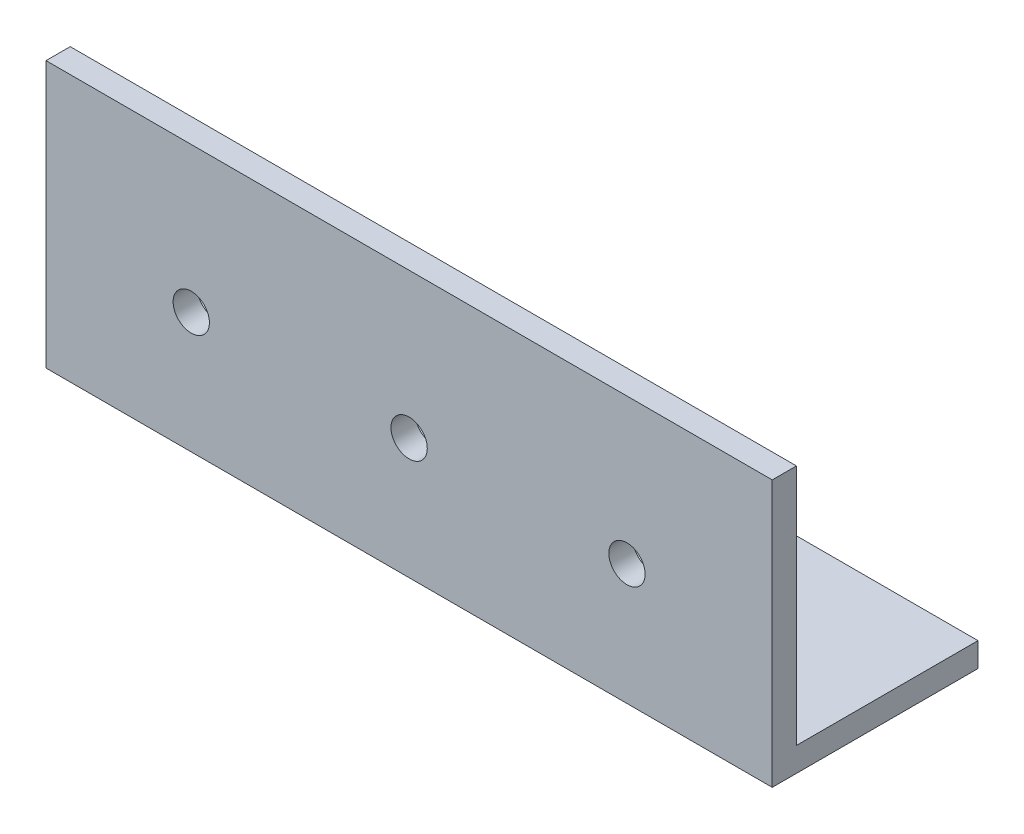
ISO-10303-21;
HEADER;
FILE_DESCRIPTION(('STEP AP214'),'2;1');
FILE_NAME('part.step','',(''),(''),'','','');
FILE_SCHEMA(('AUTOMOTIVE_DESIGN { 1 0 10303 214 1 1 1 1 }'));
ENDSEC;
DATA;
#1=APPLICATION_CONTEXT('core data for automotive mechanical design processes');
#2=APPLICATION_PROTOCOL_DEFINITION('international standard','automotive_design',2000,#1);
#3=PRODUCT_CONTEXT('',#1,'mechanical');
#4=PRODUCT('Part','Part','',(#3));
#5=PRODUCT_RELATED_PRODUCT_CATEGORY('part','',(#4));
#6=PRODUCT_DEFINITION_FORMATION('','',#4);
#7=PRODUCT_DEFINITION_CONTEXT('part definition',#1,'design');
#8=PRODUCT_DEFINITION('design','',#6,#7);
#9=PRODUCT_DEFINITION_SHAPE('','',#8);
#10=(LENGTH_UNIT() NAMED_UNIT(*) SI_UNIT(.MILLI.,.METRE.));
#11=(NAMED_UNIT(*) PLANE_ANGLE_UNIT() SI_UNIT($,.RADIAN.));
#12=(NAMED_UNIT(*) SI_UNIT($,.STERADIAN.) SOLID_ANGLE_UNIT());
#13=UNCERTAINTY_MEASURE_WITH_UNIT(LENGTH_MEASURE(1.E-05),#10,'distance_accuracy_value','');
#14=(GEOMETRIC_REPRESENTATION_CONTEXT(3) GLOBAL_UNCERTAINTY_ASSIGNED_CONTEXT((#13)) GLOBAL_UNIT_ASSIGNED_CONTEXT((#10,
#11,#12)) REPRESENTATION_CONTEXT('',''));
#15=CARTESIAN_POINT('',(0.,0.,0.));
#16=DIRECTION('',(0.,0.,1.));
#17=DIRECTION('',(1.,0.,0.));
#18=AXIS2_PLACEMENT_3D('',#15,#16,#17);
#19=CARTESIAN_POINT('',(60.,0.,-17.));
#20=DIRECTION('',(0.,1.,0.));
#21=DIRECTION('',(0.,0.,1.));
#22=AXIS2_PLACEMENT_3D('',#19,#20,#21);
#23=PLANE('',#22);
#24=CARTESIAN_POINT('',(48.,0.,-8.5));
#25=DIRECTION('',(0.,-1.,0.));
#26=DIRECTION('',(0.,0.,-1.));
#27=AXIS2_PLACEMENT_3D('',#24,#25,#26);
#28=CIRCLE('',#27,1.5);
#29=CARTESIAN_POINT('',(48.,0.,-10.));
#30=VERTEX_POINT('',#29);
#31=EDGE_CURVE('E186',#30,#30,#28,.T.);
#32=ORIENTED_EDGE('',*,*,#31,.F.);
#33=EDGE_LOOP('',(#32));
#34=FACE_BOUND('',#33,.T.);
#35=CARTESIAN_POINT('',(12.,0.,-8.5));
#36=DIRECTION('',(0.,-1.,0.));
#37=DIRECTION('',(0.,0.,-1.));
#38=AXIS2_PLACEMENT_3D('',#35,#36,#37);
#39=CIRCLE('',#38,1.5);
#40=CARTESIAN_POINT('',(12.,0.,-10.));
#41=VERTEX_POINT('',#40);
#42=EDGE_CURVE('E190',#41,#41,#39,.T.);
#43=ORIENTED_EDGE('',*,*,#42,.F.);
#44=EDGE_LOOP('',(#43));
#45=FACE_BOUND('',#44,.T.);
#46=CARTESIAN_POINT('',(30.,0.,-8.5));
#47=DIRECTION('',(0.,-1.,0.));
#48=DIRECTION('',(0.,0.,-1.));
#49=AXIS2_PLACEMENT_3D('',#46,#47,#48);
#50=CIRCLE('',#49,1.5);
#51=CARTESIAN_POINT('',(30.,0.,-10.));
#52=VERTEX_POINT('',#51);
#53=EDGE_CURVE('E148',#52,#52,#50,.T.);
#54=ORIENTED_EDGE('',*,*,#53,.F.);
#55=EDGE_LOOP('',(#54));
#56=FACE_BOUND('',#55,.T.);
#57=DIRECTION('',(0.,0.,-1.));
#58=VECTOR('',#57,1.);
#59=CARTESIAN_POINT('',(0.,0.,-17.));
#60=LINE('',#59,#58);
#61=CARTESIAN_POINT('',(0.,0.,0.));
#62=VERTEX_POINT('',#61);
#63=CARTESIAN_POINT('',(0.,0.,-17.));
#64=VERTEX_POINT('',#63);
#65=EDGE_CURVE('E129',#62,#64,#60,.T.);
#66=ORIENTED_EDGE('',*,*,#65,.T.);
#67=DIRECTION('',(-1.,0.,0.));
#68=VECTOR('',#67,1.);
#69=CARTESIAN_POINT('',(60.,0.,-17.));
#70=LINE('',#69,#68);
#71=CARTESIAN_POINT('',(60.,0.,-17.));
#72=VERTEX_POINT('',#71);
#73=EDGE_CURVE('E11',#72,#64,#70,.T.);
#74=ORIENTED_EDGE('',*,*,#73,.F.);
#75=DIRECTION('',(0.,0.,-1.));
#76=VECTOR('',#75,1.);
#77=CARTESIAN_POINT('',(60.,0.,-17.));
#78=LINE('',#77,#76);
#79=CARTESIAN_POINT('',(60.,0.,0.));
#80=VERTEX_POINT('',#79);
#81=EDGE_CURVE('E139',#80,#72,#78,.T.);
#82=ORIENTED_EDGE('',*,*,#81,.F.);
#83=DIRECTION('',(-1.,0.,0.));
#84=VECTOR('',#83,1.);
#85=CARTESIAN_POINT('',(60.,0.,0.));
#86=LINE('',#85,#84);
#87=EDGE_CURVE('E125',#80,#62,#86,.T.);
#88=ORIENTED_EDGE('',*,*,#87,.T.);
#89=EDGE_LOOP('',(#66,#74,#82,#88));
#90=FACE_BOUND('',#89,.T.);
#91=ADVANCED_FACE('F43',(#34,#45,#56,#90),#23,.F.);
#92=CARTESIAN_POINT('',(60.,2.,-17.));
#93=DIRECTION('',(0.,0.,1.));
#94=DIRECTION('',(1.,0.,0.));
#95=AXIS2_PLACEMENT_3D('',#92,#93,#94);
#96=PLANE('',#95);
#97=DIRECTION('',(0.,1.,0.));
#98=VECTOR('',#97,1.);
#99=CARTESIAN_POINT('',(0.,2.,-17.));
#100=LINE('',#99,#98);
#101=CARTESIAN_POINT('',(0.,2.,-17.));
#102=VERTEX_POINT('',#101);
#103=EDGE_CURVE('E132',#64,#102,#100,.T.);
#104=ORIENTED_EDGE('',*,*,#103,.T.);
#105=DIRECTION('',(-1.,0.,0.));
#106=VECTOR('',#105,1.);
#107=CARTESIAN_POINT('',(60.,2.,-17.));
#108=LINE('',#107,#106);
#109=CARTESIAN_POINT('',(60.,2.,-17.));
#110=VERTEX_POINT('',#109);
#111=EDGE_CURVE('E52',#110,#102,#108,.T.);
#112=ORIENTED_EDGE('',*,*,#111,.F.);
#113=DIRECTION('',(0.,1.,0.));
#114=VECTOR('',#113,1.);
#115=CARTESIAN_POINT('',(60.,2.,-17.));
#116=LINE('',#115,#114);
#117=EDGE_CURVE('E98',#72,#110,#116,.T.);
#118=ORIENTED_EDGE('',*,*,#117,.F.);
#119=ORIENTED_EDGE('',*,*,#73,.T.);
#120=EDGE_LOOP('',(#104,#112,#118,#119));
#121=FACE_BOUND('',#120,.T.);
#122=ADVANCED_FACE('F177',(#121),#96,.F.);
#123=CARTESIAN_POINT('',(60.,2.,-2.));
#124=DIRECTION('',(0.,-1.,0.));
#125=DIRECTION('',(0.,0.,-1.));
#126=AXIS2_PLACEMENT_3D('',#123,#124,#125);
#127=PLANE('',#126);
#128=CARTESIAN_POINT('',(48.,2.,-8.5));
#129=DIRECTION('',(0.,-1.,0.));
#130=DIRECTION('',(0.,0.,-1.));
#131=AXIS2_PLACEMENT_3D('',#128,#129,#130);
#132=CIRCLE('',#131,1.5);
#133=CARTESIAN_POINT('',(48.,2.,-10.));
#134=VERTEX_POINT('',#133);
#135=EDGE_CURVE('E46',#134,#134,#132,.T.);
#136=ORIENTED_EDGE('',*,*,#135,.T.);
#137=EDGE_LOOP('',(#136));
#138=FACE_BOUND('',#137,.T.);
#139=CARTESIAN_POINT('',(12.,2.,-8.5));
#140=DIRECTION('',(0.,-1.,0.));
#141=DIRECTION('',(0.,0.,-1.));
#142=AXIS2_PLACEMENT_3D('',#139,#140,#141);
#143=CIRCLE('',#142,1.5);
#144=CARTESIAN_POINT('',(12.,2.,-10.));
#145=VERTEX_POINT('',#144);
#146=EDGE_CURVE('E147',#145,#145,#143,.T.);
#147=ORIENTED_EDGE('',*,*,#146,.T.);
#148=EDGE_LOOP('',(#147));
#149=FACE_BOUND('',#148,.T.);
#150=CARTESIAN_POINT('',(30.,2.,-8.5));
#151=DIRECTION('',(0.,-1.,0.));
#152=DIRECTION('',(0.,0.,-1.));
#153=AXIS2_PLACEMENT_3D('',#150,#151,#152);
#154=CIRCLE('',#153,1.5);
#155=CARTESIAN_POINT('',(30.,2.,-10.));
#156=VERTEX_POINT('',#155);
#157=EDGE_CURVE('E145',#156,#156,#154,.T.);
#158=ORIENTED_EDGE('',*,*,#157,.T.);
#159=EDGE_LOOP('',(#158));
#160=FACE_BOUND('',#159,.T.);
#161=DIRECTION('',(0.,0.,1.));
#162=VECTOR('',#161,1.);
#163=CARTESIAN_POINT('',(0.,2.,-2.));
#164=LINE('',#163,#162);
#165=CARTESIAN_POINT('',(0.,2.,-2.));
#166=VERTEX_POINT('',#165);
#167=EDGE_CURVE('E134',#102,#166,#164,.T.);
#168=ORIENTED_EDGE('',*,*,#167,.T.);
#169=DIRECTION('',(-1.,0.,0.));
#170=VECTOR('',#169,1.);
#171=CARTESIAN_POINT('',(60.,2.,-2.));
#172=LINE('',#171,#170);
#173=CARTESIAN_POINT('',(60.,2.,-2.));
#174=VERTEX_POINT('',#173);
#175=EDGE_CURVE('E120',#174,#166,#172,.T.);
#176=ORIENTED_EDGE('',*,*,#175,.F.);
#177=DIRECTION('',(0.,0.,1.));
#178=VECTOR('',#177,1.);
#179=CARTESIAN_POINT('',(60.,2.,-2.));
#180=LINE('',#179,#178);
#181=EDGE_CURVE('E111',#110,#174,#180,.T.);
#182=ORIENTED_EDGE('',*,*,#181,.F.);
#183=ORIENTED_EDGE('',*,*,#111,.T.);
#184=EDGE_LOOP('',(#168,#176,#182,#183));
#185=FACE_BOUND('',#184,.T.);
#186=ADVANCED_FACE('F155',(#138,#149,#160,#185),#127,.F.);
#187=CARTESIAN_POINT('',(60.,22.,-2.));
#188=DIRECTION('',(0.,0.,1.));
#189=DIRECTION('',(0.,-1.,0.));
#190=AXIS2_PLACEMENT_3D('',#187,#188,#189);
#191=PLANE('',#190);
#192=CARTESIAN_POINT('',(48.,10.,-2.));
#193=DIRECTION('',(0.,0.,1.));
#194=DIRECTION('',(0.,-1.,0.));
#195=AXIS2_PLACEMENT_3D('',#192,#193,#194);
#196=CIRCLE('',#195,1.5);
#197=CARTESIAN_POINT('',(48.,8.49999999999999,-2.));
#198=VERTEX_POINT('',#197);
#199=EDGE_CURVE('E206',#198,#198,#196,.T.);
#200=ORIENTED_EDGE('',*,*,#199,.T.);
#201=EDGE_LOOP('',(#200));
#202=FACE_BOUND('',#201,.T.);
#203=CARTESIAN_POINT('',(12.,10.,-2.));
#204=DIRECTION('',(0.,0.,1.));
#205=DIRECTION('',(0.,-1.,0.));
#206=AXIS2_PLACEMENT_3D('',#203,#204,#205);
#207=CIRCLE('',#206,1.5);
#208=CARTESIAN_POINT('',(12.,8.5,-2.));
#209=VERTEX_POINT('',#208);
#210=EDGE_CURVE('E210',#209,#209,#207,.T.);
#211=ORIENTED_EDGE('',*,*,#210,.T.);
#212=EDGE_LOOP('',(#211));
#213=FACE_BOUND('',#212,.T.);
#214=CARTESIAN_POINT('',(30.,10.,-2.));
#215=DIRECTION('',(0.,0.,1.));
#216=DIRECTION('',(0.,-1.,0.));
#217=AXIS2_PLACEMENT_3D('',#214,#215,#216);
#218=CIRCLE('',#217,1.5);
#219=CARTESIAN_POINT('',(30.,8.49999999999999,-2.));
#220=VERTEX_POINT('',#219);
#221=EDGE_CURVE('E213',#220,#220,#218,.T.);
#222=ORIENTED_EDGE('',*,*,#221,.T.);
#223=EDGE_LOOP('',(#222));
#224=FACE_BOUND('',#223,.T.);
#225=DIRECTION('',(0.,1.,0.));
#226=VECTOR('',#225,1.);
#227=CARTESIAN_POINT('',(0.,22.,-2.));
#228=LINE('',#227,#226);
#229=CARTESIAN_POINT('',(0.,22.,-2.));
#230=VERTEX_POINT('',#229);
#231=EDGE_CURVE('E119',#166,#230,#228,.T.);
#232=ORIENTED_EDGE('',*,*,#231,.T.);
#233=DIRECTION('',(-1.,0.,0.));
#234=VECTOR('',#233,1.);
#235=CARTESIAN_POINT('',(60.,22.,-2.));
#236=LINE('',#235,#234);
#237=CARTESIAN_POINT('',(60.,22.,-2.));
#238=VERTEX_POINT('',#237);
#239=EDGE_CURVE('E116',#238,#230,#236,.T.);
#240=ORIENTED_EDGE('',*,*,#239,.F.);
#241=DIRECTION('',(0.,1.,0.));
#242=VECTOR('',#241,1.);
#243=CARTESIAN_POINT('',(60.,22.,-2.));
#244=LINE('',#243,#242);
#245=EDGE_CURVE('E105',#174,#238,#244,.T.);
#246=ORIENTED_EDGE('',*,*,#245,.F.);
#247=ORIENTED_EDGE('',*,*,#175,.T.);
#248=EDGE_LOOP('',(#232,#240,#246,#247));
#249=FACE_BOUND('',#248,.T.);
#250=ADVANCED_FACE('F117',(#202,#213,#224,#249),#191,.F.);
#251=CARTESIAN_POINT('',(60.,22.,0.));
#252=DIRECTION('',(0.,-1.,0.));
#253=DIRECTION('',(0.,0.,-1.));
#254=AXIS2_PLACEMENT_3D('',#251,#252,#253);
#255=PLANE('',#254);
#256=DIRECTION('',(0.,0.,1.));
#257=VECTOR('',#256,1.);
#258=CARTESIAN_POINT('',(0.,22.,0.));
#259=LINE('',#258,#257);
#260=CARTESIAN_POINT('',(0.,22.,0.));
#261=VERTEX_POINT('',#260);
#262=EDGE_CURVE('E84',#230,#261,#259,.T.);
#263=ORIENTED_EDGE('',*,*,#262,.T.);
#264=DIRECTION('',(-1.,0.,0.));
#265=VECTOR('',#264,1.);
#266=CARTESIAN_POINT('',(60.,22.,0.));
#267=LINE('',#266,#265);
#268=CARTESIAN_POINT('',(60.,22.,0.));
#269=VERTEX_POINT('',#268);
#270=EDGE_CURVE('E121',#269,#261,#267,.T.);
#271=ORIENTED_EDGE('',*,*,#270,.F.);
#272=DIRECTION('',(0.,0.,1.));
#273=VECTOR('',#272,1.);
#274=CARTESIAN_POINT('',(60.,22.,0.));
#275=LINE('',#274,#273);
#276=EDGE_CURVE('E109',#238,#269,#275,.T.);
#277=ORIENTED_EDGE('',*,*,#276,.F.);
#278=ORIENTED_EDGE('',*,*,#239,.T.);
#279=EDGE_LOOP('',(#263,#271,#277,#278));
#280=FACE_BOUND('',#279,.T.);
#281=ADVANCED_FACE('F123',(#280),#255,.F.);
#282=CARTESIAN_POINT('',(60.,0.,0.));
#283=DIRECTION('',(0.,0.,-1.));
#284=DIRECTION('',(-1.,0.,0.));
#285=AXIS2_PLACEMENT_3D('',#282,#283,#284);
#286=PLANE('',#285);
#287=CARTESIAN_POINT('',(48.,10.,0.));
#288=DIRECTION('',(0.,0.,1.));
#289=DIRECTION('',(1.,0.,0.));
#290=AXIS2_PLACEMENT_3D('',#287,#288,#289);
#291=CIRCLE('',#290,1.5);
#292=CARTESIAN_POINT('',(49.5,10.,0.));
#293=VERTEX_POINT('',#292);
#294=EDGE_CURVE('E220',#293,#293,#291,.T.);
#295=ORIENTED_EDGE('',*,*,#294,.F.);
#296=EDGE_LOOP('',(#295));
#297=FACE_BOUND('',#296,.T.);
#298=CARTESIAN_POINT('',(12.,10.,0.));
#299=DIRECTION('',(0.,0.,1.));
#300=DIRECTION('',(1.,0.,0.));
#301=AXIS2_PLACEMENT_3D('',#298,#299,#300);
#302=CIRCLE('',#301,1.5);
#303=CARTESIAN_POINT('',(13.5,10.,0.));
#304=VERTEX_POINT('',#303);
#305=EDGE_CURVE('E219',#304,#304,#302,.T.);
#306=ORIENTED_EDGE('',*,*,#305,.F.);
#307=EDGE_LOOP('',(#306));
#308=FACE_BOUND('',#307,.T.);
#309=CARTESIAN_POINT('',(30.,10.,0.));
#310=DIRECTION('',(0.,0.,1.));
#311=DIRECTION('',(1.,0.,0.));
#312=AXIS2_PLACEMENT_3D('',#309,#310,#311);
#313=CIRCLE('',#312,1.5);
#314=CARTESIAN_POINT('',(31.5,10.,0.));
#315=VERTEX_POINT('',#314);
#316=EDGE_CURVE('E216',#315,#315,#313,.T.);
#317=ORIENTED_EDGE('',*,*,#316,.F.);
#318=EDGE_LOOP('',(#317));
#319=FACE_BOUND('',#318,.T.);
#320=DIRECTION('',(0.,-1.,0.));
#321=VECTOR('',#320,1.);
#322=CARTESIAN_POINT('',(0.,0.,0.));
#323=LINE('',#322,#321);
#324=EDGE_CURVE('E90',#261,#62,#323,.T.);
#325=ORIENTED_EDGE('',*,*,#324,.T.);
#326=ORIENTED_EDGE('',*,*,#87,.F.);
#327=DIRECTION('',(0.,-1.,0.));
#328=VECTOR('',#327,1.);
#329=CARTESIAN_POINT('',(60.,0.,0.));
#330=LINE('',#329,#328);
#331=EDGE_CURVE('E61',#269,#80,#330,.T.);
#332=ORIENTED_EDGE('',*,*,#331,.F.);
#333=ORIENTED_EDGE('',*,*,#270,.T.);
#334=EDGE_LOOP('',(#325,#326,#332,#333));
#335=FACE_BOUND('',#334,.T.);
#336=ADVANCED_FACE('F228',(#297,#308,#319,#335),#286,.F.);
#337=CARTESIAN_POINT('',(60.,0.,0.));
#338=DIRECTION('',(-1.,0.,0.));
#339=DIRECTION('',(0.,0.,1.));
#340=AXIS2_PLACEMENT_3D('',#337,#338,#339);
#341=PLANE('',#340);
#342=ORIENTED_EDGE('',*,*,#81,.T.);
#343=ORIENTED_EDGE('',*,*,#117,.T.);
#344=ORIENTED_EDGE('',*,*,#181,.T.);
#345=ORIENTED_EDGE('',*,*,#245,.T.);
#346=ORIENTED_EDGE('',*,*,#276,.T.);
#347=ORIENTED_EDGE('',*,*,#331,.T.);
#348=EDGE_LOOP('',(#342,#343,#344,#345,#346,#347));
#349=FACE_BOUND('',#348,.T.);
#350=ADVANCED_FACE('F107',(#349),#341,.F.);
#351=CARTESIAN_POINT('',(0.,0.,0.));
#352=DIRECTION('',(-1.,0.,0.));
#353=DIRECTION('',(0.,0.,1.));
#354=AXIS2_PLACEMENT_3D('',#351,#352,#353);
#355=PLANE('',#354);
#356=ORIENTED_EDGE('',*,*,#65,.F.);
#357=ORIENTED_EDGE('',*,*,#324,.F.);
#358=ORIENTED_EDGE('',*,*,#262,.F.);
#359=ORIENTED_EDGE('',*,*,#231,.F.);
#360=ORIENTED_EDGE('',*,*,#167,.F.);
#361=ORIENTED_EDGE('',*,*,#103,.F.);
#362=EDGE_LOOP('',(#356,#357,#358,#359,#360,#361));
#363=FACE_BOUND('',#362,.T.);
#364=ADVANCED_FACE('F198',(#363),#355,.T.);
#365=CARTESIAN_POINT('',(30.,10.,-8.5));
#366=DIRECTION('',(0.,-1.,0.));
#367=DIRECTION('',(0.,0.,-1.));
#368=AXIS2_PLACEMENT_3D('',#365,#366,#367);
#369=CYLINDRICAL_SURFACE('',#368,1.5);
#370=ORIENTED_EDGE('',*,*,#53,.T.);
#371=EDGE_LOOP('',(#370));
#372=FACE_BOUND('',#371,.T.);
#373=ORIENTED_EDGE('',*,*,#157,.F.);
#374=EDGE_LOOP('',(#373));
#375=FACE_BOUND('',#374,.T.);
#376=ADVANCED_FACE('F171',(#372,#375),#369,.F.);
#377=CARTESIAN_POINT('',(12.,10.,-8.5));
#378=DIRECTION('',(0.,-1.,0.));
#379=DIRECTION('',(0.,0.,-1.));
#380=AXIS2_PLACEMENT_3D('',#377,#378,#379);
#381=CYLINDRICAL_SURFACE('',#380,1.5);
#382=ORIENTED_EDGE('',*,*,#42,.T.);
#383=EDGE_LOOP('',(#382));
#384=FACE_BOUND('',#383,.T.);
#385=ORIENTED_EDGE('',*,*,#146,.F.);
#386=EDGE_LOOP('',(#385));
#387=FACE_BOUND('',#386,.T.);
#388=ADVANCED_FACE('F160',(#384,#387),#381,.F.);
#389=CARTESIAN_POINT('',(48.,10.,-8.5));
#390=DIRECTION('',(0.,-1.,0.));
#391=DIRECTION('',(0.,0.,-1.));
#392=AXIS2_PLACEMENT_3D('',#389,#390,#391);
#393=CYLINDRICAL_SURFACE('',#392,1.5);
#394=ORIENTED_EDGE('',*,*,#31,.T.);
#395=EDGE_LOOP('',(#394));
#396=FACE_BOUND('',#395,.T.);
#397=ORIENTED_EDGE('',*,*,#135,.F.);
#398=EDGE_LOOP('',(#397));
#399=FACE_BOUND('',#398,.T.);
#400=ADVANCED_FACE('F157',(#396,#399),#393,.F.);
#401=CARTESIAN_POINT('',(30.,10.,-10.));
#402=DIRECTION('',(0.,0.,1.));
#403=DIRECTION('',(1.,0.,0.));
#404=AXIS2_PLACEMENT_3D('',#401,#402,#403);
#405=CYLINDRICAL_SURFACE('',#404,1.5);
#406=ORIENTED_EDGE('',*,*,#316,.T.);
#407=EDGE_LOOP('',(#406));
#408=FACE_BOUND('',#407,.T.);
#409=ORIENTED_EDGE('',*,*,#221,.F.);
#410=EDGE_LOOP('',(#409));
#411=FACE_BOUND('',#410,.T.);
#412=ADVANCED_FACE('F159',(#408,#411),#405,.F.);
#413=CARTESIAN_POINT('',(12.,10.,-10.));
#414=DIRECTION('',(0.,0.,1.));
#415=DIRECTION('',(1.,0.,0.));
#416=AXIS2_PLACEMENT_3D('',#413,#414,#415);
#417=CYLINDRICAL_SURFACE('',#416,1.5);
#418=ORIENTED_EDGE('',*,*,#305,.T.);
#419=EDGE_LOOP('',(#418));
#420=FACE_BOUND('',#419,.T.);
#421=ORIENTED_EDGE('',*,*,#210,.F.);
#422=EDGE_LOOP('',(#421));
#423=FACE_BOUND('',#422,.T.);
#424=ADVANCED_FACE('F168',(#420,#423),#417,.F.);
#425=CARTESIAN_POINT('',(48.,10.,-10.));
#426=DIRECTION('',(0.,0.,1.));
#427=DIRECTION('',(1.,0.,0.));
#428=AXIS2_PLACEMENT_3D('',#425,#426,#427);
#429=CYLINDRICAL_SURFACE('',#428,1.5);
#430=ORIENTED_EDGE('',*,*,#294,.T.);
#431=EDGE_LOOP('',(#430));
#432=FACE_BOUND('',#431,.T.);
#433=ORIENTED_EDGE('',*,*,#199,.F.);
#434=EDGE_LOOP('',(#433));
#435=FACE_BOUND('',#434,.T.);
#436=ADVANCED_FACE('F284',(#432,#435),#429,.F.);
#437=CLOSED_SHELL('',(#91,#122,#186,#250,#281,#336,#350,#364,#376,#388,#400,#412,#424,#436));
#438=MANIFOLD_SOLID_BREP('B2',#437);
#439=ADVANCED_BREP_SHAPE_REPRESENTATION('',(#18,#438),#14);
#440=SHAPE_DEFINITION_REPRESENTATION(#9,#439);
ENDSEC;
END-ISO-10303-21;
